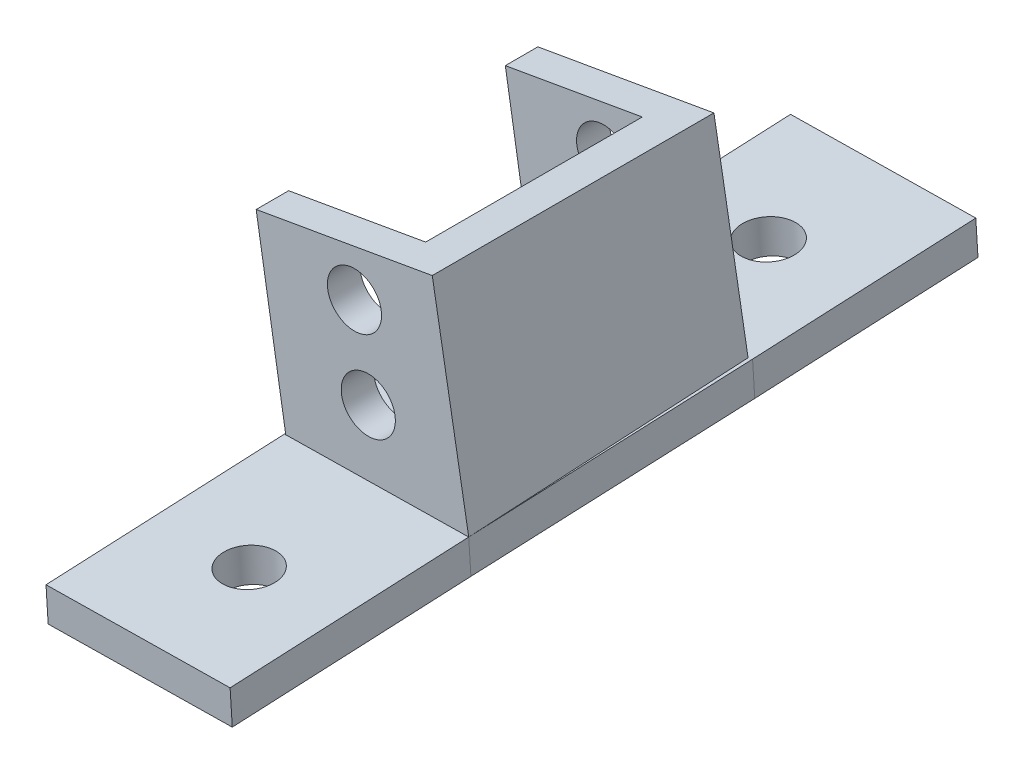
ISO-10303-21;
HEADER;
FILE_DESCRIPTION(('STEP AP214'),'2;1');
FILE_NAME('part.step','',(''),(''),'','','');
FILE_SCHEMA(('AUTOMOTIVE_DESIGN { 1 0 10303 214 1 1 1 1 }'));
ENDSEC;
DATA;
#1=APPLICATION_CONTEXT('core data for automotive mechanical design processes');
#2=APPLICATION_PROTOCOL_DEFINITION('international standard','automotive_design',2000,#1);
#3=PRODUCT_CONTEXT('',#1,'mechanical');
#4=PRODUCT('Part','Part','',(#3));
#5=PRODUCT_RELATED_PRODUCT_CATEGORY('part','',(#4));
#6=PRODUCT_DEFINITION_FORMATION('','',#4);
#7=PRODUCT_DEFINITION_CONTEXT('part definition',#1,'design');
#8=PRODUCT_DEFINITION('design','',#6,#7);
#9=PRODUCT_DEFINITION_SHAPE('','',#8);
#10=(LENGTH_UNIT() NAMED_UNIT(*) SI_UNIT(.MILLI.,.METRE.));
#11=(NAMED_UNIT(*) PLANE_ANGLE_UNIT() SI_UNIT($,.RADIAN.));
#12=(NAMED_UNIT(*) SI_UNIT($,.STERADIAN.) SOLID_ANGLE_UNIT());
#13=UNCERTAINTY_MEASURE_WITH_UNIT(LENGTH_MEASURE(1.E-05),#10,'distance_accuracy_value','');
#14=(GEOMETRIC_REPRESENTATION_CONTEXT(3) GLOBAL_UNCERTAINTY_ASSIGNED_CONTEXT((#13)) GLOBAL_UNIT_ASSIGNED_CONTEXT((#10,
#11,#12)) REPRESENTATION_CONTEXT('',''));
#15=CARTESIAN_POINT('',(0.,0.,0.));
#16=DIRECTION('',(0.,0.,1.));
#17=DIRECTION('',(1.,0.,0.));
#18=AXIS2_PLACEMENT_3D('',#15,#16,#17);
#19=CARTESIAN_POINT('',(498.681202462749,87.317720274916,-29.2100000000001));
#20=DIRECTION('',(0.98501419279853,0.172473302239679,0.));
#21=DIRECTION('',(-0.172473302239679,0.98501419279853,0.));
#22=AXIS2_PLACEMENT_3D('',#19,#20,#21);
#23=PLANE('',#22);
#24=DIRECTION('',(-0.172473302239677,0.985014192798531,0.));
#25=VECTOR('',#24,1.);
#26=CARTESIAN_POINT('',(465.115245633873,279.01662927684,3.81000000000005));
#27=LINE('',#26,#25);
#28=CARTESIAN_POINT('',(469.389805577824,254.604142485644,3.81000000000004));
#29=VERTEX_POINT('',#28);
#30=CARTESIAN_POINT('',(465.115245633873,279.01662927684,3.81000000000005));
#31=VERTEX_POINT('',#30);
#32=EDGE_CURVE('E305',#29,#31,#27,.T.);
#33=ORIENTED_EDGE('',*,*,#32,.F.);
#34=DIRECTION('',(-0.00822642058245933,0.0469820019935131,-0.998861861066425));
#35=VECTOR('',#34,1.);
#36=CARTESIAN_POINT('',(469.185115745679,255.773148860348,-21.0436851025813));
#37=LINE('',#36,#35);
#38=CARTESIAN_POINT('',(469.117859657952,256.157255850258,-29.2100000000001));
#39=VERTEX_POINT('',#38);
#40=EDGE_CURVE('E243',#29,#39,#37,.T.);
#41=ORIENTED_EDGE('',*,*,#40,.T.);
#42=DIRECTION('',(-0.172473302239679,0.98501419279853,0.));
#43=VECTOR('',#42,1.);
#44=CARTESIAN_POINT('',(498.681202462749,87.317720274916,-29.2100000000001));
#45=LINE('',#44,#43);
#46=CARTESIAN_POINT('',(465.115245633873,279.01662927684,-29.2100000000001));
#47=VERTEX_POINT('',#46);
#48=EDGE_CURVE('E321',#39,#47,#45,.T.);
#49=ORIENTED_EDGE('',*,*,#48,.T.);
#50=DIRECTION('',(0.,0.,1.));
#51=VECTOR('',#50,1.);
#52=CARTESIAN_POINT('',(465.115245633873,279.01662927684,-29.2100000000001));
#53=LINE('',#52,#51);
#54=EDGE_CURVE('E339',#47,#31,#53,.T.);
#55=ORIENTED_EDGE('',*,*,#54,.T.);
#56=EDGE_LOOP('',(#33,#41,#49,#55));
#57=FACE_BOUND('',#56,.T.);
#58=ADVANCED_FACE('F41',(#57),#23,.T.);
#59=CARTESIAN_POINT('',(457.615851501661,262.11967258304,-29.2100000000001));
#60=DIRECTION('',(0.,0.,1.));
#61=DIRECTION('',(1.,0.,0.));
#62=AXIS2_PLACEMENT_3D('',#59,#60,#61);
#63=CYLINDRICAL_SURFACE('',#62,7.69984137252156);
#64=CARTESIAN_POINT('',(457.615851501661,262.11967258304,-25.3999999999999));
#65=DIRECTION('',(0.,0.,1.));
#66=DIRECTION('',(0.,-1.,0.));
#67=AXIS2_PLACEMENT_3D('',#64,#65,#66);
#68=CIRCLE('',#67,7.69984137252155);
#69=CARTESIAN_POINT('',(464.120754614761,266.239598874999,-25.3999999999999));
#70=VERTEX_POINT('',#69);
#71=CARTESIAN_POINT('',(462.108239380544,255.86619288709,-25.3999999999999));
#72=VERTEX_POINT('',#71);
#73=EDGE_CURVE('E274',#70,#72,#68,.F.);
#74=ORIENTED_EDGE('',*,*,#73,.T.);
#75=CARTESIAN_POINT('',(457.615851501661,262.11967258304,-159.496560465678));
#76=DIRECTION('',(0.0158669670077986,-0.998763770637884,-0.0471080653303698));
#77=DIRECTION('',(0.000748292874032119,-0.0471021217881431,0.998889798817082));
#78=AXIS2_PLACEMENT_3D('',#75,#76,#77);
#79=ELLIPSE('',#78,163.450596379249,7.69984137252156);
#80=CARTESIAN_POINT('',(459.380786964946,254.624837029645,0.));
#81=VERTEX_POINT('',#80);
#82=EDGE_CURVE('E63',#72,#81,#79,.T.);
#83=ORIENTED_EDGE('',*,*,#82,.T.);
#84=CARTESIAN_POINT('',(457.615851501661,262.11967258304,0.));
#85=DIRECTION('',(0.,0.,1.));
#86=DIRECTION('',(1.,0.,0.));
#87=AXIS2_PLACEMENT_3D('',#84,#85,#86);
#88=CIRCLE('',#87,7.69984137252156);
#89=CARTESIAN_POINT('',(464.120754614761,266.239598874999,0.));
#90=VERTEX_POINT('',#89);
#91=EDGE_CURVE('E329',#90,#81,#88,.F.);
#92=ORIENTED_EDGE('',*,*,#91,.F.);
#93=DIRECTION('',(0.,0.,1.));
#94=VECTOR('',#93,1.);
#95=CARTESIAN_POINT('',(464.120754614761,266.239598874999,-29.2100000000001));
#96=LINE('',#95,#94);
#97=EDGE_CURVE('E326',#70,#90,#96,.T.);
#98=ORIENTED_EDGE('',*,*,#97,.F.);
#99=EDGE_LOOP('',(#74,#83,#92,#98));
#100=FACE_BOUND('',#99,.T.);
#101=ADVANCED_FACE('F388',(#100),#63,.F.);
#102=CARTESIAN_POINT('',(0.,0.,3.81000000000005));
#103=DIRECTION('',(0.,0.,-1.));
#104=DIRECTION('',(-1.,0.,0.));
#105=AXIS2_PLACEMENT_3D('',#102,#103,#104);
#106=PLANE('',#105);
#107=CARTESIAN_POINT('',(457.615851501661,262.11967258304,3.81000000000005));
#108=DIRECTION('',(0.,0.,1.));
#109=DIRECTION('',(1.,0.,0.));
#110=AXIS2_PLACEMENT_3D('',#107,#108,#109);
#111=CIRCLE('',#110,3.17500000000015);
#112=CARTESIAN_POINT('',(460.790851501661,262.11967258304,3.81000000000005));
#113=VERTEX_POINT('',#112);
#114=EDGE_CURVE('E286',#113,#113,#111,.T.);
#115=ORIENTED_EDGE('',*,*,#114,.F.);
#116=EDGE_LOOP('',(#115));
#117=FACE_BOUND('',#116,.T.);
#118=CARTESIAN_POINT('',(455.996603091062,271.987703520607,3.81000000000005));
#119=DIRECTION('',(0.,0.,1.));
#120=DIRECTION('',(1.,0.,0.));
#121=AXIS2_PLACEMENT_3D('',#118,#119,#120);
#122=CIRCLE('',#121,3.17500000000002);
#123=CARTESIAN_POINT('',(459.171603091062,271.987703520607,3.81000000000005));
#124=VERTEX_POINT('',#123);
#125=EDGE_CURVE('E292',#124,#124,#122,.T.);
#126=ORIENTED_EDGE('',*,*,#125,.F.);
#127=EDGE_LOOP('',(#126));
#128=FACE_BOUND('',#127,.T.);
#129=DIRECTION('',(-0.99987383174866,-0.0158846021118534,0.));
#130=VECTOR('',#129,1.);
#131=CARTESIAN_POINT('',(-3.92533852899942,247.084771042046,3.81000000000005));
#132=LINE('',#131,#130);
#133=CARTESIAN_POINT('',(447.939496861059,254.263369871817,3.81000000000005));
#134=VERTEX_POINT('',#133);
#135=EDGE_CURVE('E241',#29,#134,#132,.T.);
#136=ORIENTED_EDGE('',*,*,#135,.F.);
#137=ORIENTED_EDGE('',*,*,#32,.T.);
#138=DIRECTION('',(-0.98501419279853,-0.17247330223968,0.));
#139=VECTOR('',#138,1.);
#140=CARTESIAN_POINT('',(444.470875732127,275.401856336873,3.81000000000005));
#141=LINE('',#140,#139);
#142=CARTESIAN_POINT('',(444.470875732127,275.401856336873,3.81000000000005));
#143=VERTEX_POINT('',#142);
#144=EDGE_CURVE('E298',#31,#143,#141,.T.);
#145=ORIENTED_EDGE('',*,*,#144,.T.);
#146=DIRECTION('',(0.161924841059876,-0.986803093756669,0.));
#147=VECTOR('',#146,1.);
#148=CARTESIAN_POINT('',(448.484233443171,250.943633746141,3.81000000000005));
#149=LINE('',#148,#147);
#150=EDGE_CURVE('E301',#143,#134,#149,.T.);
#151=ORIENTED_EDGE('',*,*,#150,.T.);
#152=EDGE_LOOP('',(#136,#137,#145,#151));
#153=FACE_BOUND('',#152,.T.);
#154=ADVANCED_FACE('F405',(#117,#128,#153),#106,.F.);
#155=CARTESIAN_POINT('',(0.,0.,0.));
#156=DIRECTION('',(0.,0.,-1.));
#157=DIRECTION('',(-1.,0.,0.));
#158=AXIS2_PLACEMENT_3D('',#155,#156,#157);
#159=PLANE('',#158);
#160=CARTESIAN_POINT('',(455.996603091062,271.987703520607,0.));
#161=DIRECTION('',(0.,0.,1.));
#162=DIRECTION('',(1.,0.,0.));
#163=AXIS2_PLACEMENT_3D('',#160,#161,#162);
#164=CIRCLE('',#163,3.17500000000002);
#165=CARTESIAN_POINT('',(459.171603091062,271.987703520607,0.));
#166=VERTEX_POINT('',#165);
#167=EDGE_CURVE('E289',#166,#166,#164,.T.);
#168=ORIENTED_EDGE('',*,*,#167,.T.);
#169=EDGE_LOOP('',(#168));
#170=FACE_BOUND('',#169,.T.);
#171=CARTESIAN_POINT('',(457.615851501661,262.11967258304,0.));
#172=DIRECTION('',(0.,0.,1.));
#173=DIRECTION('',(1.,0.,0.));
#174=AXIS2_PLACEMENT_3D('',#171,#172,#173);
#175=CIRCLE('',#174,3.17500000000015);
#176=CARTESIAN_POINT('',(460.790851501661,262.11967258304,0.));
#177=VERTEX_POINT('',#176);
#178=EDGE_CURVE('E270',#177,#177,#175,.T.);
#179=ORIENTED_EDGE('',*,*,#178,.T.);
#180=EDGE_LOOP('',(#179));
#181=FACE_BOUND('',#180,.T.);
#182=ORIENTED_EDGE('',*,*,#91,.T.);
#183=DIRECTION('',(-0.99987383174866,-0.0158846021118534,0.));
#184=VECTOR('',#183,1.);
#185=CARTESIAN_POINT('',(-3.92819269354634,247.264429583184,0.));
#186=LINE('',#185,#184);
#187=CARTESIAN_POINT('',(447.910085861906,254.442606514974,0.));
#188=VERTEX_POINT('',#187);
#189=EDGE_CURVE('E236',#81,#188,#186,.T.);
#190=ORIENTED_EDGE('',*,*,#189,.T.);
#191=DIRECTION('',(0.161924841059876,-0.986803093756669,0.));
#192=VECTOR('',#191,1.);
#193=CARTESIAN_POINT('',(448.484233443171,250.943633746141,0.));
#194=LINE('',#193,#192);
#195=CARTESIAN_POINT('',(444.470875732127,275.401856336873,0.));
#196=VERTEX_POINT('',#195);
#197=EDGE_CURVE('E302',#196,#188,#194,.T.);
#198=ORIENTED_EDGE('',*,*,#197,.F.);
#199=DIRECTION('',(-0.98501419279853,-0.17247330223968,0.));
#200=VECTOR('',#199,1.);
#201=CARTESIAN_POINT('',(444.470875732127,275.401856336873,0.));
#202=LINE('',#201,#200);
#203=CARTESIAN_POINT('',(460.527946700846,278.213405728261,0.));
#204=VERTEX_POINT('',#203);
#205=EDGE_CURVE('E295',#204,#196,#202,.T.);
#206=ORIENTED_EDGE('',*,*,#205,.F.);
#207=CARTESIAN_POINT('',(455.996603091062,271.987703520606,0.));
#208=DIRECTION('',(0.,0.,1.));
#209=DIRECTION('',(1.,0.,0.));
#210=AXIS2_PLACEMENT_3D('',#207,#208,#209);
#211=CIRCLE('',#210,7.70015862747854);
#212=CARTESIAN_POINT('',(463.477224231209,270.162121354303,0.));
#213=VERTEX_POINT('',#212);
#214=EDGE_CURVE('E318',#204,#213,#211,.F.);
#215=ORIENTED_EDGE('',*,*,#214,.T.);
#216=CARTESIAN_POINT('',(468.41238949603,268.957736113234,0.));
#217=DIRECTION('',(0.,0.,1.));
#218=DIRECTION('',(1.,0.,0.));
#219=AXIS2_PLACEMENT_3D('',#216,#217,#218);
#220=CIRCLE('',#219,5.07999999999995);
#221=EDGE_CURVE('E314',#213,#90,#220,.T.);
#222=ORIENTED_EDGE('',*,*,#221,.T.);
#223=EDGE_LOOP('',(#182,#190,#198,#206,#215,#222));
#224=FACE_BOUND('',#223,.T.);
#225=ADVANCED_FACE('F400',(#170,#181,#224),#159,.T.);
#226=CARTESIAN_POINT('',(448.484233443171,250.943633746141,3.81000000000005));
#227=DIRECTION('',(0.986803093756669,0.161924841059876,0.));
#228=DIRECTION('',(-0.161924841059876,0.986803093756669,0.));
#229=AXIS2_PLACEMENT_3D('',#226,#227,#228);
#230=PLANE('',#229);
#231=DIRECTION('',(-0.00771066529743336,0.0469903710920786,-0.998865581880415));
#232=VECTOR('',#231,1.);
#233=CARTESIAN_POINT('',(447.940732078134,254.255842206374,3.97001418478583));
#234=LINE('',#233,#232);
#235=EDGE_CURVE('E239',#134,#188,#234,.T.);
#236=ORIENTED_EDGE('',*,*,#235,.F.);
#237=ORIENTED_EDGE('',*,*,#150,.F.);
#238=DIRECTION('',(0.,0.,-1.));
#239=VECTOR('',#238,1.);
#240=CARTESIAN_POINT('',(444.470875732127,275.401856336873,3.81000000000005));
#241=LINE('',#240,#239);
#242=EDGE_CURVE('E308',#143,#196,#241,.T.);
#243=ORIENTED_EDGE('',*,*,#242,.T.);
#244=ORIENTED_EDGE('',*,*,#197,.T.);
#245=EDGE_LOOP('',(#236,#237,#243,#244));
#246=FACE_BOUND('',#245,.T.);
#247=ADVANCED_FACE('F403',(#246),#230,.F.);
#248=CARTESIAN_POINT('',(468.41238949603,268.957736113234,-29.2100000000001));
#249=DIRECTION('',(0.,0.,1.));
#250=DIRECTION('',(1.,0.,0.));
#251=AXIS2_PLACEMENT_3D('',#248,#249,#250);
#252=CYLINDRICAL_SURFACE('',#251,5.07999999999995);
#253=CARTESIAN_POINT('',(468.41238949603,268.957736113234,-25.3999999999999));
#254=DIRECTION('',(0.,0.,1.));
#255=DIRECTION('',(0.,-1.,0.));
#256=AXIS2_PLACEMENT_3D('',#253,#254,#255);
#257=CIRCLE('',#256,5.07999999999984);
#258=CARTESIAN_POINT('',(463.477224231209,270.162121354303,-25.3999999999999));
#259=VERTEX_POINT('',#258);
#260=EDGE_CURVE('E264',#259,#70,#257,.T.);
#261=ORIENTED_EDGE('',*,*,#260,.T.);
#262=ORIENTED_EDGE('',*,*,#97,.T.);
#263=ORIENTED_EDGE('',*,*,#221,.F.);
#264=DIRECTION('',(0.,0.,1.));
#265=VECTOR('',#264,1.);
#266=CARTESIAN_POINT('',(463.477224231209,270.162121354303,-29.2100000000001));
#267=LINE('',#266,#265);
#268=EDGE_CURVE('E334',#259,#213,#267,.T.);
#269=ORIENTED_EDGE('',*,*,#268,.F.);
#270=EDGE_LOOP('',(#261,#262,#263,#269));
#271=FACE_BOUND('',#270,.T.);
#272=ADVANCED_FACE('F43',(#271),#252,.T.);
#273=CARTESIAN_POINT('',(455.996603091062,271.987703520606,-29.2100000000001));
#274=DIRECTION('',(0.,0.,1.));
#275=DIRECTION('',(1.,0.,0.));
#276=AXIS2_PLACEMENT_3D('',#273,#274,#275);
#277=CYLINDRICAL_SURFACE('',#276,7.70015862747854);
#278=CARTESIAN_POINT('',(455.996603091062,271.987703520606,-25.3999999999999));
#279=DIRECTION('',(0.,0.,1.));
#280=DIRECTION('',(0.,-1.,0.));
#281=AXIS2_PLACEMENT_3D('',#278,#279,#280);
#282=CIRCLE('',#281,7.70015862747852);
#283=CARTESIAN_POINT('',(460.527946700846,278.213405728261,-25.3999999999999));
#284=VERTEX_POINT('',#283);
#285=EDGE_CURVE('E256',#284,#259,#282,.F.);
#286=ORIENTED_EDGE('',*,*,#285,.T.);
#287=ORIENTED_EDGE('',*,*,#268,.T.);
#288=ORIENTED_EDGE('',*,*,#214,.F.);
#289=DIRECTION('',(0.,0.,1.));
#290=VECTOR('',#289,1.);
#291=CARTESIAN_POINT('',(460.527946700846,278.213405728261,-29.2100000000001));
#292=LINE('',#291,#290);
#293=EDGE_CURVE('E337',#284,#204,#292,.T.);
#294=ORIENTED_EDGE('',*,*,#293,.F.);
#295=EDGE_LOOP('',(#286,#287,#288,#294));
#296=FACE_BOUND('',#295,.T.);
#297=ADVANCED_FACE('F395',(#296),#277,.F.);
#298=CARTESIAN_POINT('',(-33.5659568288758,191.698909001924,-29.2100000000001));
#299=DIRECTION('',(-0.172473302239678,0.985014192798531,0.));
#300=DIRECTION('',(-0.985014192798531,-0.172473302239678,0.));
#301=AXIS2_PLACEMENT_3D('',#298,#299,#300);
#302=PLANE('',#301);
#303=DIRECTION('',(-0.985014192798531,-0.172473302239678,0.));
#304=VECTOR('',#303,1.);
#305=CARTESIAN_POINT('',(-33.5659568288758,191.698909001924,-29.2100000000001));
#306=LINE('',#305,#304);
#307=CARTESIAN_POINT('',(444.470875732127,275.401856336873,-29.2100000000001));
#308=VERTEX_POINT('',#307);
#309=EDGE_CURVE('E323',#47,#308,#306,.T.);
#310=ORIENTED_EDGE('',*,*,#309,.T.);
#311=DIRECTION('',(0.,0.,-1.));
#312=VECTOR('',#311,1.);
#313=CARTESIAN_POINT('',(444.470875732127,275.401856336873,7.4948703570335));
#314=LINE('',#313,#312);
#315=CARTESIAN_POINT('',(444.470875732127,275.401856336873,-25.3999999999999));
#316=VERTEX_POINT('',#315);
#317=EDGE_CURVE('E281',#316,#308,#314,.T.);
#318=ORIENTED_EDGE('',*,*,#317,.F.);
#319=DIRECTION('',(0.985014192798531,0.172473302239677,0.));
#320=VECTOR('',#319,1.);
#321=CARTESIAN_POINT('',(460.527946700846,278.213405728261,-25.3999999999999));
#322=LINE('',#321,#320);
#323=EDGE_CURVE('E276',#316,#284,#322,.T.);
#324=ORIENTED_EDGE('',*,*,#323,.T.);
#325=ORIENTED_EDGE('',*,*,#293,.T.);
#326=ORIENTED_EDGE('',*,*,#205,.T.);
#327=ORIENTED_EDGE('',*,*,#242,.F.);
#328=ORIENTED_EDGE('',*,*,#144,.F.);
#329=ORIENTED_EDGE('',*,*,#54,.F.);
#330=EDGE_LOOP('',(#310,#318,#324,#325,#326,#327,#328,#329));
#331=FACE_BOUND('',#330,.T.);
#332=ADVANCED_FACE('F359',(#331),#302,.T.);
#333=CARTESIAN_POINT('',(0.,0.,-29.2100000000001));
#334=DIRECTION('',(0.,0.,1.));
#335=DIRECTION('',(1.,0.,0.));
#336=AXIS2_PLACEMENT_3D('',#333,#334,#335);
#337=PLANE('',#336);
#338=DIRECTION('',(0.99987383174866,0.0158846021118534,0.));
#339=VECTOR('',#338,1.);
#340=CARTESIAN_POINT('',(-3.95007462173938,248.641811731907,-29.2100000000001));
#341=LINE('',#340,#339);
#342=CARTESIAN_POINT('',(447.79263768417,255.818470440295,-29.2100000000001));
#343=VERTEX_POINT('',#342);
#344=EDGE_CURVE('E246',#343,#39,#341,.T.);
#345=ORIENTED_EDGE('',*,*,#344,.F.);
#346=DIRECTION('',(0.0158493514724076,-0.999874391140159,0.));
#347=VECTOR('',#346,1.);
#348=CARTESIAN_POINT('',(451.734198866806,7.16059352393478,-29.2100000000001));
#349=LINE('',#348,#347);
#350=CARTESIAN_POINT('',(447.806156780717,254.965602835448,-29.2100000000001));
#351=VERTEX_POINT('',#350);
#352=EDGE_CURVE('E250',#343,#351,#349,.T.);
#353=ORIENTED_EDGE('',*,*,#352,.T.);
#354=DIRECTION('',(-0.161073092456062,0.98694248002943,0.));
#355=VECTOR('',#354,1.);
#356=CARTESIAN_POINT('',(444.470875732127,275.401856336873,-29.2100000000001));
#357=LINE('',#356,#355);
#358=EDGE_CURVE('E257',#351,#308,#357,.T.);
#359=ORIENTED_EDGE('',*,*,#358,.T.);
#360=ORIENTED_EDGE('',*,*,#309,.F.);
#361=ORIENTED_EDGE('',*,*,#48,.F.);
#362=EDGE_LOOP('',(#345,#353,#359,#360,#361));
#363=FACE_BOUND('',#362,.T.);
#364=CARTESIAN_POINT('',(455.996603091062,271.987703520606,-29.2100000000001));
#365=DIRECTION('',(0.,0.,-1.));
#366=DIRECTION('',(-1.,0.,0.));
#367=AXIS2_PLACEMENT_3D('',#364,#365,#366);
#368=CIRCLE('',#367,3.17500000000009);
#369=CARTESIAN_POINT('',(452.821603091062,271.987703520606,-29.2100000000001));
#370=VERTEX_POINT('',#369);
#371=EDGE_CURVE('E260',#370,#370,#368,.T.);
#372=ORIENTED_EDGE('',*,*,#371,.F.);
#373=EDGE_LOOP('',(#372));
#374=FACE_BOUND('',#373,.T.);
#375=CARTESIAN_POINT('',(457.615851501661,262.11967258304,-29.2100000000001));
#376=DIRECTION('',(0.,0.,-1.));
#377=DIRECTION('',(-1.,0.,0.));
#378=AXIS2_PLACEMENT_3D('',#375,#376,#377);
#379=CIRCLE('',#378,3.1750000000002);
#380=CARTESIAN_POINT('',(454.440851501661,262.11967258304,-29.2100000000001));
#381=VERTEX_POINT('',#380);
#382=EDGE_CURVE('E261',#381,#381,#379,.T.);
#383=ORIENTED_EDGE('',*,*,#382,.F.);
#384=EDGE_LOOP('',(#383));
#385=FACE_BOUND('',#384,.T.);
#386=ADVANCED_FACE('F366',(#363,#374,#385),#337,.F.);
#387=CARTESIAN_POINT('',(455.996603091062,271.987703520607,3.81000000000005));
#388=DIRECTION('',(0.,0.,-1.));
#389=DIRECTION('',(-1.,0.,0.));
#390=AXIS2_PLACEMENT_3D('',#387,#388,#389);
#391=CYLINDRICAL_SURFACE('',#390,3.17500000000002);
#392=ORIENTED_EDGE('',*,*,#125,.T.);
#393=EDGE_LOOP('',(#392));
#394=FACE_BOUND('',#393,.T.);
#395=ORIENTED_EDGE('',*,*,#167,.F.);
#396=EDGE_LOOP('',(#395));
#397=FACE_BOUND('',#396,.T.);
#398=ADVANCED_FACE('F488',(#394,#397),#391,.F.);
#399=CARTESIAN_POINT('',(457.615851501661,262.11967258304,3.81000000000005));
#400=DIRECTION('',(0.,0.,-1.));
#401=DIRECTION('',(-1.,0.,0.));
#402=AXIS2_PLACEMENT_3D('',#399,#400,#401);
#403=CYLINDRICAL_SURFACE('',#402,3.17500000000015);
#404=ORIENTED_EDGE('',*,*,#114,.T.);
#405=EDGE_LOOP('',(#404));
#406=FACE_BOUND('',#405,.T.);
#407=ORIENTED_EDGE('',*,*,#178,.F.);
#408=EDGE_LOOP('',(#407));
#409=FACE_BOUND('',#408,.T.);
#410=ADVANCED_FACE('F477',(#406,#409),#403,.F.);
#411=CARTESIAN_POINT('',(444.470875732127,275.401856336873,7.4948703570335));
#412=DIRECTION('',(-0.98694248002943,-0.161073092456062,0.));
#413=DIRECTION('',(0.161073092456062,-0.98694248002943,0.));
#414=AXIS2_PLACEMENT_3D('',#411,#412,#413);
#415=PLANE('',#414);
#416=DIRECTION('',(0.000828067210890824,-0.00507381272865655,-0.99998678527723));
#417=VECTOR('',#416,1.);
#418=CARTESIAN_POINT('',(447.775674933697,255.152374128124,7.60035042736024));
#419=LINE('',#418,#417);
#420=CARTESIAN_POINT('',(447.803001802951,254.984934317404,-25.3999999999999));
#421=VERTEX_POINT('',#420);
#422=EDGE_CURVE('E248',#421,#351,#419,.T.);
#423=ORIENTED_EDGE('',*,*,#422,.F.);
#424=DIRECTION('',(-0.161073092456062,0.98694248002943,0.));
#425=VECTOR('',#424,1.);
#426=CARTESIAN_POINT('',(444.470875732127,275.401856336873,-25.3999999999999));
#427=LINE('',#426,#425);
#428=EDGE_CURVE('E279',#421,#316,#427,.T.);
#429=ORIENTED_EDGE('',*,*,#428,.T.);
#430=ORIENTED_EDGE('',*,*,#317,.T.);
#431=ORIENTED_EDGE('',*,*,#358,.F.);
#432=EDGE_LOOP('',(#423,#429,#430,#431));
#433=FACE_BOUND('',#432,.T.);
#434=ADVANCED_FACE('F351',(#433),#415,.T.);
#435=CARTESIAN_POINT('',(457.615851501661,262.11967258304,7.4948703570335));
#436=DIRECTION('',(0.,0.,-1.));
#437=DIRECTION('',(-1.,0.,0.));
#438=AXIS2_PLACEMENT_3D('',#435,#436,#437);
#439=CYLINDRICAL_SURFACE('',#438,3.1750000000002);
#440=ORIENTED_EDGE('',*,*,#382,.T.);
#441=EDGE_LOOP('',(#440));
#442=FACE_BOUND('',#441,.T.);
#443=CARTESIAN_POINT('',(457.615851501661,262.11967258304,-25.3999999999999));
#444=DIRECTION('',(0.,0.,1.));
#445=DIRECTION('',(0.,-1.,0.));
#446=AXIS2_PLACEMENT_3D('',#443,#444,#445);
#447=CIRCLE('',#446,3.1750000000002);
#448=CARTESIAN_POINT('',(457.615851501661,258.94467258304,-25.3999999999999));
#449=VERTEX_POINT('',#448);
#450=EDGE_CURVE('E267',#449,#449,#447,.F.);
#451=ORIENTED_EDGE('',*,*,#450,.F.);
#452=EDGE_LOOP('',(#451));
#453=FACE_BOUND('',#452,.T.);
#454=ADVANCED_FACE('F476',(#442,#453),#439,.F.);
#455=CARTESIAN_POINT('',(455.996603091062,271.987703520606,7.4948703570335));
#456=DIRECTION('',(0.,0.,-1.));
#457=DIRECTION('',(-1.,0.,0.));
#458=AXIS2_PLACEMENT_3D('',#455,#456,#457);
#459=CYLINDRICAL_SURFACE('',#458,3.17500000000009);
#460=ORIENTED_EDGE('',*,*,#371,.T.);
#461=EDGE_LOOP('',(#460));
#462=FACE_BOUND('',#461,.T.);
#463=CARTESIAN_POINT('',(455.996603091062,271.987703520606,-25.3999999999999));
#464=DIRECTION('',(0.,0.,1.));
#465=DIRECTION('',(0.,-1.,0.));
#466=AXIS2_PLACEMENT_3D('',#463,#464,#465);
#467=CIRCLE('',#466,3.17500000000009);
#468=CARTESIAN_POINT('',(455.996603091062,268.812703520606,-25.3999999999999));
#469=VERTEX_POINT('',#468);
#470=EDGE_CURVE('E259',#469,#469,#467,.F.);
#471=ORIENTED_EDGE('',*,*,#470,.F.);
#472=EDGE_LOOP('',(#471));
#473=FACE_BOUND('',#472,.T.);
#474=ADVANCED_FACE('F480',(#462,#473),#459,.F.);
#475=CARTESIAN_POINT('',(423.885341344546,271.355710845468,-25.3999999999999));
#476=DIRECTION('',(0.,0.,1.));
#477=DIRECTION('',(0.99987383174866,0.015884602111849,0.));
#478=AXIS2_PLACEMENT_3D('',#475,#476,#477);
#479=PLANE('',#478);
#480=DIRECTION('',(0.0158493514724076,-0.999874391140159,0.));
#481=VECTOR('',#480,1.);
#482=CARTESIAN_POINT('',(447.537560040376,271.730630265881,-25.3999999999999));
#483=LINE('',#482,#481);
#484=CARTESIAN_POINT('',(447.79263768417,255.638766556168,-25.3999999999999));
#485=VERTEX_POINT('',#484);
#486=EDGE_CURVE('E49',#485,#421,#483,.T.);
#487=ORIENTED_EDGE('',*,*,#486,.F.);
#488=DIRECTION('',(0.99987383174866,0.0158846021118534,0.));
#489=VECTOR('',#488,1.);
#490=CARTESIAN_POINT('',(424.140999555138,255.263022288198,-25.3999999999999));
#491=LINE('',#490,#489);
#492=EDGE_CURVE('E336',#485,#72,#491,.T.);
#493=ORIENTED_EDGE('',*,*,#492,.T.);
#494=ORIENTED_EDGE('',*,*,#73,.F.);
#495=ORIENTED_EDGE('',*,*,#260,.F.);
#496=ORIENTED_EDGE('',*,*,#285,.F.);
#497=ORIENTED_EDGE('',*,*,#323,.F.);
#498=ORIENTED_EDGE('',*,*,#428,.F.);
#499=EDGE_LOOP('',(#487,#493,#494,#495,#496,#497,#498));
#500=FACE_BOUND('',#499,.T.);
#501=ORIENTED_EDGE('',*,*,#470,.T.);
#502=EDGE_LOOP('',(#501));
#503=FACE_BOUND('',#502,.T.);
#504=ORIENTED_EDGE('',*,*,#450,.T.);
#505=EDGE_LOOP('',(#504));
#506=FACE_BOUND('',#505,.T.);
#507=ADVANCED_FACE('F353',(#500,#503,#506),#479,.T.);
#508=CARTESIAN_POINT('',(447.857121038089,251.765764997611,-29.534391915135));
#509=DIRECTION('',(-0.999874111755062,-0.0158493470437787,-0.000747556226939629));
#510=DIRECTION('',(0.0158493514724076,-0.999874391140159,0.));
#511=AXIS2_PLACEMENT_3D('',#508,#509,#510);
#512=PLANE('',#511);
#513=ORIENTED_EDGE('',*,*,#352,.F.);
#514=DIRECTION('',(0.,-0.0471139964286938,0.998889519086329));
#515=VECTOR('',#514,1.);
#516=CARTESIAN_POINT('',(447.79263768417,255.824740961483,-29.3429447376324));
#517=LINE('',#516,#515);
#518=CARTESIAN_POINT('',(447.79263768417,257.059132725519,-55.5139573667171));
#519=VERTEX_POINT('',#518);
#520=EDGE_CURVE('E195',#519,#343,#517,.T.);
#521=ORIENTED_EDGE('',*,*,#520,.F.);
#522=DIRECTION('',(-0.0158669670077987,0.998763770637884,0.0471080653303704));
#523=VECTOR('',#522,1.);
#524=CARTESIAN_POINT('',(447.857121038089,253.000156761647,-55.7054045442197));
#525=LINE('',#524,#523);
#526=CARTESIAN_POINT('',(447.857121038089,253.000156761647,-55.7054045442197));
#527=VERTEX_POINT('',#526);
#528=EDGE_CURVE('E193',#527,#519,#525,.T.);
#529=ORIENTED_EDGE('',*,*,#528,.F.);
#530=DIRECTION('',(0.,-0.0471139964286922,0.998889519086329));
#531=VECTOR('',#530,1.);
#532=CARTESIAN_POINT('',(447.857121038089,248.883346416878,31.5773355578611));
#533=LINE('',#532,#531);
#534=CARTESIAN_POINT('',(447.857121038089,248.883346416878,31.5773355578611));
#535=VERTEX_POINT('',#534);
#536=EDGE_CURVE('E185',#527,#535,#533,.T.);
#537=ORIENTED_EDGE('',*,*,#536,.T.);
#538=DIRECTION('',(-0.0158669670077987,0.998763770637884,0.0471080653303704));
#539=VECTOR('',#538,1.);
#540=CARTESIAN_POINT('',(447.857121038089,248.883346416878,31.5773355578611));
#541=LINE('',#540,#539);
#542=CARTESIAN_POINT('',(447.79263768417,252.94232238075,31.7687827353638));
#543=VERTEX_POINT('',#542);
#544=EDGE_CURVE('E169',#535,#543,#541,.T.);
#545=ORIENTED_EDGE('',*,*,#544,.T.);
#546=EDGE_CURVE('E198',#485,#543,#517,.T.);
#547=ORIENTED_EDGE('',*,*,#546,.F.);
#548=ORIENTED_EDGE('',*,*,#486,.T.);
#549=ORIENTED_EDGE('',*,*,#422,.T.);
#550=EDGE_LOOP('',(#513,#521,#529,#537,#545,#547,#548,#549));
#551=FACE_BOUND('',#550,.T.);
#552=ADVANCED_FACE('F191',(#551),#512,.T.);
#553=CARTESIAN_POINT('',(-3.91947536687693,246.715707823699,11.6366852942257));
#554=DIRECTION('',(0.0158669670077986,-0.998763770637884,-0.0471080653303698));
#555=DIRECTION('',(0.,0.0471139964286922,-0.998889519086329));
#556=AXIS2_PLACEMENT_3D('',#553,#554,#555);
#557=PLANE('',#556);
#558=CARTESIAN_POINT('',(458.71902194913,256.594758870369,-41.9882827983921));
#559=DIRECTION('',(-0.0158669670077987,0.998763770637884,0.0471080653303704));
#560=DIRECTION('',(0.,-0.0471139964286928,0.998889519086329));
#561=AXIS2_PLACEMENT_3D('',#558,#559,#560);
#562=CIRCLE('',#561,3.16237023182455);
#563=CARTESIAN_POINT('',(458.71902194913,256.445766970561,-38.829424318352));
#564=VERTEX_POINT('',#563);
#565=EDGE_CURVE('E201',#564,#564,#562,.T.);
#566=ORIENTED_EDGE('',*,*,#565,.F.);
#567=EDGE_LOOP('',(#566));
#568=FACE_BOUND('',#567,.T.);
#569=ORIENTED_EDGE('',*,*,#520,.T.);
#570=ORIENTED_EDGE('',*,*,#344,.T.);
#571=ORIENTED_EDGE('',*,*,#40,.F.);
#572=DIRECTION('',(0.00416880034680002,0.0471796680114716,-0.998877720259089));
#573=VECTOR('',#572,1.);
#574=CARTESIAN_POINT('',(469.528101046345,256.169277236535,-29.3266942109003));
#575=LINE('',#574,#573);
#576=CARTESIAN_POINT('',(469.528101046345,256.169277236535,-29.3266942109003));
#577=VERTEX_POINT('',#576);
#578=EDGE_CURVE('E217',#29,#577,#575,.T.);
#579=ORIENTED_EDGE('',*,*,#578,.T.);
#580=DIRECTION('',(0.,0.0471139964286937,-0.998889519086329));
#581=VECTOR('',#580,1.);
#582=CARTESIAN_POINT('',(469.528101046345,257.403669000571,-55.497706839985));
#583=LINE('',#582,#581);
#584=CARTESIAN_POINT('',(469.528101046345,257.403669000571,-55.497706839985));
#585=VERTEX_POINT('',#584);
#586=EDGE_CURVE('E220',#577,#585,#583,.T.);
#587=ORIENTED_EDGE('',*,*,#586,.T.);
#588=DIRECTION('',(-0.999874111755062,-0.0158493470437786,-0.000747556226939445));
#589=VECTOR('',#588,1.);
#590=CARTESIAN_POINT('',(447.79263768417,257.059132725519,-55.5139573667171));
#591=LINE('',#590,#589);
#592=EDGE_CURVE('E223',#585,#519,#591,.T.);
#593=ORIENTED_EDGE('',*,*,#592,.T.);
#594=EDGE_LOOP('',(#569,#570,#571,#579,#587,#593));
#595=FACE_BOUND('',#594,.T.);
#596=ADVANCED_FACE('F369',(#568,#595),#557,.F.);
#597=CARTESIAN_POINT('',(458.71902194913,253.72382083633,18.8800393463522));
#598=DIRECTION('',(-0.0158669670077987,0.998763770637884,0.0471080653303704));
#599=DIRECTION('',(0.,-0.0471139964286928,0.998889519086329));
#600=AXIS2_PLACEMENT_3D('',#597,#598,#599);
#601=CIRCLE('',#600,3.09134503326153);
#602=CARTESIAN_POINT('',(458.71902194913,253.578175217473,21.9679514999567));
#603=VERTEX_POINT('',#602);
#604=EDGE_CURVE('E448',#603,#603,#601,.T.);
#605=ORIENTED_EDGE('',*,*,#604,.F.);
#606=EDGE_LOOP('',(#605));
#607=FACE_BOUND('',#606,.T.);
#608=DIRECTION('',(0.,0.0471139964286939,-0.998889519086329));
#609=VECTOR('',#608,1.);
#610=CARTESIAN_POINT('',(469.389805577824,254.604142485644,3.81000000000004));
#611=LINE('',#610,#609);
#612=CARTESIAN_POINT('',(469.389805577824,253.284666486958,31.7849298654408));
#613=VERTEX_POINT('',#612);
#614=EDGE_CURVE('E213',#613,#29,#611,.T.);
#615=ORIENTED_EDGE('',*,*,#614,.T.);
#616=ORIENTED_EDGE('',*,*,#135,.T.);
#617=ORIENTED_EDGE('',*,*,#235,.T.);
#618=ORIENTED_EDGE('',*,*,#189,.F.);
#619=ORIENTED_EDGE('',*,*,#82,.F.);
#620=ORIENTED_EDGE('',*,*,#492,.F.);
#621=ORIENTED_EDGE('',*,*,#546,.T.);
#622=DIRECTION('',(0.999874111755062,0.0158493470437763,0.000747556226939559));
#623=VECTOR('',#622,1.);
#624=CARTESIAN_POINT('',(469.389805577824,253.284666486958,31.7849298654408));
#625=LINE('',#624,#623);
#626=EDGE_CURVE('E174',#543,#613,#625,.T.);
#627=ORIENTED_EDGE('',*,*,#626,.T.);
#628=EDGE_LOOP('',(#615,#616,#617,#618,#619,#620,#621,#627));
#629=FACE_BOUND('',#628,.T.);
#630=ADVANCED_FACE('F384',(#607,#629),#557,.F.);
#631=CARTESIAN_POINT('',(447.857121038089,253.000156761647,-55.7054045442197));
#632=DIRECTION('',(0.,0.0471139964286928,-0.998889519086329));
#633=DIRECTION('',(0.,0.998889519086329,0.0471139964286929));
#634=AXIS2_PLACEMENT_3D('',#631,#632,#633);
#635=PLANE('',#634);
#636=ORIENTED_EDGE('',*,*,#592,.F.);
#637=DIRECTION('',(-0.0158669670077987,0.998763770637884,0.0471080653303704));
#638=VECTOR('',#637,1.);
#639=CARTESIAN_POINT('',(469.592584400264,253.344693036698,-55.6891540174876));
#640=LINE('',#639,#638);
#641=CARTESIAN_POINT('',(469.592584400264,253.344693036698,-55.6891540174876));
#642=VERTEX_POINT('',#641);
#643=EDGE_CURVE('E227',#642,#585,#640,.T.);
#644=ORIENTED_EDGE('',*,*,#643,.F.);
#645=DIRECTION('',(-0.999874111755062,-0.0158493470437786,-0.000747556226939445));
#646=VECTOR('',#645,1.);
#647=CARTESIAN_POINT('',(447.857121038089,253.000156761647,-55.7054045442197));
#648=LINE('',#647,#646);
#649=EDGE_CURVE('E179',#642,#527,#648,.T.);
#650=ORIENTED_EDGE('',*,*,#649,.T.);
#651=ORIENTED_EDGE('',*,*,#528,.T.);
#652=EDGE_LOOP('',(#636,#644,#650,#651));
#653=FACE_BOUND('',#652,.T.);
#654=ADVANCED_FACE('F373',(#653),#635,.T.);
#655=CARTESIAN_POINT('',(469.592584400264,253.344693036698,-55.6891540174876));
#656=DIRECTION('',(0.999874111755062,0.0158493470437787,0.000747556226939629));
#657=DIRECTION('',(-0.0158493514724076,0.999874391140159,0.));
#658=AXIS2_PLACEMENT_3D('',#655,#656,#657);
#659=PLANE('',#658);
#660=ORIENTED_EDGE('',*,*,#586,.F.);
#661=DIRECTION('',(-0.0158669670077987,0.998763770637884,0.0471080653303704));
#662=VECTOR('',#661,1.);
#663=CARTESIAN_POINT('',(469.592584400264,252.110301272662,-29.5181413884029));
#664=LINE('',#663,#662);
#665=CARTESIAN_POINT('',(469.592584400264,252.110301272662,-29.5181413884029));
#666=VERTEX_POINT('',#665);
#667=EDGE_CURVE('E229',#666,#577,#664,.T.);
#668=ORIENTED_EDGE('',*,*,#667,.F.);
#669=DIRECTION('',(0.,0.0471139964286937,-0.998889519086329));
#670=VECTOR('',#669,1.);
#671=CARTESIAN_POINT('',(469.592584400264,253.344693036698,-55.6891540174876));
#672=LINE('',#671,#670);
#673=EDGE_CURVE('E208',#666,#642,#672,.T.);
#674=ORIENTED_EDGE('',*,*,#673,.T.);
#675=ORIENTED_EDGE('',*,*,#643,.T.);
#676=EDGE_LOOP('',(#660,#668,#674,#675));
#677=FACE_BOUND('',#676,.T.);
#678=ADVANCED_FACE('F376',(#677),#659,.T.);
#679=CARTESIAN_POINT('',(469.592584400264,252.110301272662,-29.5181413884029));
#680=DIRECTION('',(0.999865421175091,0.0156527757130898,0.00491224498918342));
#681=DIRECTION('',(-0.0156529645684271,0.999877484845128,0.));
#682=AXIS2_PLACEMENT_3D('',#679,#680,#681);
#683=PLANE('',#682);
#684=ORIENTED_EDGE('',*,*,#578,.F.);
#685=DIRECTION('',(-0.0158669670077987,0.998763770637884,0.0471080653303704));
#686=VECTOR('',#685,1.);
#687=CARTESIAN_POINT('',(469.454288931744,250.545166521772,3.61855282249742));
#688=LINE('',#687,#686);
#689=CARTESIAN_POINT('',(469.454288931744,250.545166521772,3.61855282249742));
#690=VERTEX_POINT('',#689);
#691=EDGE_CURVE('E231',#690,#29,#688,.T.);
#692=ORIENTED_EDGE('',*,*,#691,.F.);
#693=DIRECTION('',(0.00416880034680002,0.0471796680114716,-0.998877720259089));
#694=VECTOR('',#693,1.);
#695=CARTESIAN_POINT('',(469.592584400264,252.110301272662,-29.5181413884029));
#696=LINE('',#695,#694);
#697=EDGE_CURVE('E205',#690,#666,#696,.T.);
#698=ORIENTED_EDGE('',*,*,#697,.T.);
#699=ORIENTED_EDGE('',*,*,#667,.T.);
#700=EDGE_LOOP('',(#684,#692,#698,#699));
#701=FACE_BOUND('',#700,.T.);
#702=ADVANCED_FACE('F379',(#701),#683,.T.);
#703=CARTESIAN_POINT('',(469.454288931744,250.545166521772,3.61855282249742));
#704=DIRECTION('',(0.999874111755062,0.0158493470437787,0.000747556226939632));
#705=DIRECTION('',(-0.0158493514724076,0.999874391140159,0.));
#706=AXIS2_PLACEMENT_3D('',#703,#704,#705);
#707=PLANE('',#706);
#708=ORIENTED_EDGE('',*,*,#614,.F.);
#709=DIRECTION('',(-0.0158669670077987,0.998763770637884,0.0471080653303704));
#710=VECTOR('',#709,1.);
#711=CARTESIAN_POINT('',(469.454288931744,249.225690523086,31.5934826879381));
#712=LINE('',#711,#710);
#713=CARTESIAN_POINT('',(469.454288931744,249.225690523086,31.5934826879381));
#714=VERTEX_POINT('',#713);
#715=EDGE_CURVE('E178',#714,#613,#712,.T.);
#716=ORIENTED_EDGE('',*,*,#715,.F.);
#717=DIRECTION('',(0.,0.0471139964286939,-0.998889519086329));
#718=VECTOR('',#717,1.);
#719=CARTESIAN_POINT('',(469.454288931744,250.545166521772,3.61855282249742));
#720=LINE('',#719,#718);
#721=EDGE_CURVE('E189',#714,#690,#720,.T.);
#722=ORIENTED_EDGE('',*,*,#721,.T.);
#723=ORIENTED_EDGE('',*,*,#691,.T.);
#724=EDGE_LOOP('',(#708,#716,#722,#723));
#725=FACE_BOUND('',#724,.T.);
#726=ADVANCED_FACE('F382',(#725),#707,.T.);
#727=CARTESIAN_POINT('',(469.454288931744,249.225690523086,31.5934826879381));
#728=DIRECTION('',(0.,-0.0471139964286928,0.998889519086329));
#729=DIRECTION('',(0.,-0.998889519086329,-0.0471139964286929));
#730=AXIS2_PLACEMENT_3D('',#727,#728,#729);
#731=PLANE('',#730);
#732=ORIENTED_EDGE('',*,*,#626,.F.);
#733=ORIENTED_EDGE('',*,*,#544,.F.);
#734=DIRECTION('',(0.999874111755062,0.0158493470437763,0.000747556226939559));
#735=VECTOR('',#734,1.);
#736=CARTESIAN_POINT('',(469.454288931744,249.225690523086,31.5934826879381));
#737=LINE('',#736,#735);
#738=EDGE_CURVE('E172',#535,#714,#737,.T.);
#739=ORIENTED_EDGE('',*,*,#738,.T.);
#740=ORIENTED_EDGE('',*,*,#715,.T.);
#741=EDGE_LOOP('',(#732,#733,#739,#740));
#742=FACE_BOUND('',#741,.T.);
#743=ADVANCED_FACE('F171',(#742),#731,.T.);
#744=CARTESIAN_POINT('',(-3.85499201295724,242.656731859826,11.445238116723));
#745=DIRECTION('',(0.0158669670077986,-0.998763770637884,-0.0471080653303698));
#746=DIRECTION('',(0.,0.0471139964286922,-0.998889519086329));
#747=AXIS2_PLACEMENT_3D('',#744,#745,#746);
#748=PLANE('',#747);
#749=DIRECTION('',(0.00822642058245933,-0.0469820019935131,0.998861861066425));
#750=VECTOR('',#749,1.);
#751=CARTESIAN_POINT('',(448.408573725304,251.375734801523,-21.0794085039445));
#752=LINE('',#751,#750);
#753=CARTESIAN_POINT('',(448.341611848153,251.758161522139,-29.2100000000001));
#754=VERTEX_POINT('',#753);
#755=CARTESIAN_POINT('',(448.484233443171,250.943633746141,-11.8927147481675));
#756=VERTEX_POINT('',#755);
#757=EDGE_CURVE('E253',#754,#756,#752,.T.);
#758=ORIENTED_EDGE('',*,*,#757,.T.);
#759=DIRECTION('',(0.283698028038711,0.0496747519908367,-0.957626152473707));
#760=VECTOR('',#759,1.);
#761=CARTESIAN_POINT('',(413.556418749868,244.827868527516,106.006549586864));
#762=LINE('',#761,#760);
#763=CARTESIAN_POINT('',(453.614502352639,251.841929858687,-29.2100000000001));
#764=VERTEX_POINT('',#763);
#765=EDGE_CURVE('E56',#756,#764,#762,.T.);
#766=ORIENTED_EDGE('',*,*,#765,.T.);
#767=DIRECTION('',(0.99987383174866,0.0158846021118534,0.));
#768=VECTOR('',#767,1.);
#769=CARTESIAN_POINT('',(-3.88544785003842,244.573808177322,-29.2100000000001));
#770=LINE('',#769,#768);
#771=EDGE_CURVE('E11',#754,#764,#770,.T.);
#772=ORIENTED_EDGE('',*,*,#771,.F.);
#773=EDGE_LOOP('',(#758,#766,#772));
#774=FACE_BOUND('',#773,.T.);
#775=CARTESIAN_POINT('',(458.78350530305,249.664844872458,18.6885921688495));
#776=DIRECTION('',(-0.0158669670077987,0.998763770637884,0.0471080653303704));
#777=DIRECTION('',(0.,-0.0471139964286928,0.998889519086329));
#778=AXIS2_PLACEMENT_3D('',#775,#776,#777);
#779=CIRCLE('',#778,3.09134503326153);
#780=CARTESIAN_POINT('',(458.78350530305,249.519199253601,21.7765043224541));
#781=VERTEX_POINT('',#780);
#782=EDGE_CURVE('E442',#781,#781,#779,.T.);
#783=ORIENTED_EDGE('',*,*,#782,.T.);
#784=EDGE_LOOP('',(#783));
#785=FACE_BOUND('',#784,.T.);
#786=CARTESIAN_POINT('',(458.78350530305,252.535782906497,-42.1797299758948));
#787=DIRECTION('',(-0.0158669670077987,0.998763770637884,0.0471080653303704));
#788=DIRECTION('',(0.,-0.0471139964286928,0.998889519086329));
#789=AXIS2_PLACEMENT_3D('',#786,#787,#788);
#790=CIRCLE('',#789,3.16237023182455);
#791=CARTESIAN_POINT('',(458.78350530305,252.386791006688,-39.0208714958546));
#792=VERTEX_POINT('',#791);
#793=EDGE_CURVE('E214',#792,#792,#790,.T.);
#794=ORIENTED_EDGE('',*,*,#793,.T.);
#795=EDGE_LOOP('',(#794));
#796=FACE_BOUND('',#795,.T.);
#797=ORIENTED_EDGE('',*,*,#536,.F.);
#798=ORIENTED_EDGE('',*,*,#649,.F.);
#799=ORIENTED_EDGE('',*,*,#673,.F.);
#800=ORIENTED_EDGE('',*,*,#697,.F.);
#801=ORIENTED_EDGE('',*,*,#721,.F.);
#802=ORIENTED_EDGE('',*,*,#738,.F.);
#803=EDGE_LOOP('',(#797,#798,#799,#800,#801,#802));
#804=FACE_BOUND('',#803,.T.);
#805=ADVANCED_FACE('F183',(#774,#785,#796,#804),#748,.T.);
#806=CARTESIAN_POINT('',(458.78350530305,252.535782906497,-42.1797299758948));
#807=DIRECTION('',(-0.0158669670077987,0.998763770637884,0.0471080653303704));
#808=DIRECTION('',(0.,-0.0471139964286928,0.998889519086329));
#809=AXIS2_PLACEMENT_3D('',#806,#807,#808);
#810=CYLINDRICAL_SURFACE('',#809,3.16237023182455);
#811=ORIENTED_EDGE('',*,*,#793,.F.);
#812=EDGE_LOOP('',(#811));
#813=FACE_BOUND('',#812,.T.);
#814=ORIENTED_EDGE('',*,*,#565,.T.);
#815=EDGE_LOOP('',(#814));
#816=FACE_BOUND('',#815,.T.);
#817=ADVANCED_FACE('F437',(#813,#816),#810,.F.);
#818=CARTESIAN_POINT('',(458.78350530305,249.664844872458,18.6885921688495));
#819=DIRECTION('',(-0.0158669670077987,0.998763770637884,0.0471080653303704));
#820=DIRECTION('',(0.,-0.0471139964286928,0.998889519086329));
#821=AXIS2_PLACEMENT_3D('',#818,#819,#820);
#822=CYLINDRICAL_SURFACE('',#821,3.09134503326153);
#823=ORIENTED_EDGE('',*,*,#782,.F.);
#824=EDGE_LOOP('',(#823));
#825=FACE_BOUND('',#824,.T.);
#826=ORIENTED_EDGE('',*,*,#604,.T.);
#827=EDGE_LOOP('',(#826));
#828=FACE_BOUND('',#827,.T.);
#829=ADVANCED_FACE('F428',(#825,#828),#822,.F.);
#830=DIRECTION('',(0.172473302239679,-0.98501419279853,0.));
#831=VECTOR('',#830,1.);
#832=CARTESIAN_POINT('',(477.775630328096,83.6572115354132,-29.2100000000001));
#833=LINE('',#832,#831);
#834=CARTESIAN_POINT('',(448.484233443171,250.943633746141,-29.2100000000001));
#835=VERTEX_POINT('',#834);
#836=EDGE_CURVE('E315',#754,#835,#833,.T.);
#837=ORIENTED_EDGE('',*,*,#836,.F.);
#838=ORIENTED_EDGE('',*,*,#771,.T.);
#839=DIRECTION('',(0.985014192798531,0.172473302239678,0.));
#840=VECTOR('',#839,1.);
#841=CARTESIAN_POINT('',(-29.2913968849246,167.286422210729,-29.2100000000001));
#842=LINE('',#841,#840);
#843=EDGE_CURVE('E317',#835,#764,#842,.T.);
#844=ORIENTED_EDGE('',*,*,#843,.F.);
#845=EDGE_LOOP('',(#837,#838,#844));
#846=FACE_BOUND('',#845,.T.);
#847=ADVANCED_FACE('F423',(#846),#337,.F.);
#848=CARTESIAN_POINT('',(477.775630328096,83.6572115354132,-29.2100000000001));
#849=DIRECTION('',(-0.98501419279853,-0.172473302239679,0.));
#850=DIRECTION('',(0.172473302239679,-0.98501419279853,0.));
#851=AXIS2_PLACEMENT_3D('',#848,#849,#850);
#852=PLANE('',#851);
#853=ORIENTED_EDGE('',*,*,#757,.F.);
#854=ORIENTED_EDGE('',*,*,#836,.T.);
#855=DIRECTION('',(0.,0.,1.));
#856=VECTOR('',#855,1.);
#857=CARTESIAN_POINT('',(448.484233443171,250.943633746141,-29.2100000000001));
#858=LINE('',#857,#856);
#859=EDGE_CURVE('E341',#835,#756,#858,.T.);
#860=ORIENTED_EDGE('',*,*,#859,.T.);
#861=EDGE_LOOP('',(#853,#854,#860));
#862=FACE_BOUND('',#861,.T.);
#863=ADVANCED_FACE('F420',(#862),#852,.T.);
#864=CARTESIAN_POINT('',(-29.2913968849246,167.286422210729,-29.2100000000001));
#865=DIRECTION('',(0.172473302239678,-0.985014192798531,0.));
#866=DIRECTION('',(0.985014192798531,0.172473302239678,0.));
#867=AXIS2_PLACEMENT_3D('',#864,#865,#866);
#868=PLANE('',#867);
#869=ORIENTED_EDGE('',*,*,#765,.F.);
#870=ORIENTED_EDGE('',*,*,#859,.F.);
#871=ORIENTED_EDGE('',*,*,#843,.T.);
#872=EDGE_LOOP('',(#869,#870,#871));
#873=FACE_BOUND('',#872,.T.);
#874=ADVANCED_FACE('F417',(#873),#868,.T.);
#875=CLOSED_SHELL('',(#58,#101,#154,#225,#247,#272,#297,#332,#386,#398,#410,#434,#454,#474,#507,
#552,#596,#630,#654,#678,#702,#726,#743,#805,#817,#829,#847,#863,#874));
#876=MANIFOLD_SOLID_BREP('B2',#875);
#877=ADVANCED_BREP_SHAPE_REPRESENTATION('',(#18,#876),#14);
#878=SHAPE_DEFINITION_REPRESENTATION(#9,#877);
ENDSEC;
END-ISO-10303-21;
